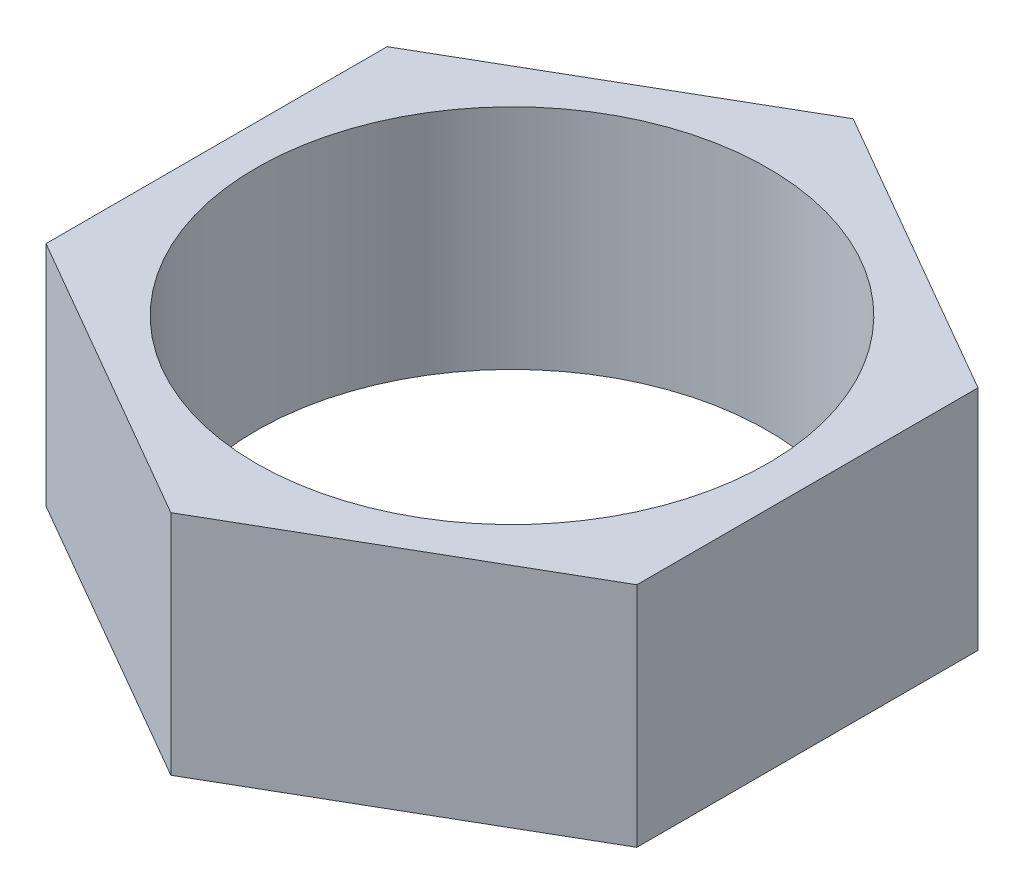
ISO-10303-21;
HEADER;
FILE_DESCRIPTION(('STEP AP214'),'2;1');
FILE_NAME('part.step','',(''),(''),'','','');
FILE_SCHEMA(('AUTOMOTIVE_DESIGN { 1 0 10303 214 1 1 1 1 }'));
ENDSEC;
DATA;
#1=APPLICATION_CONTEXT('core data for automotive mechanical design processes');
#2=APPLICATION_PROTOCOL_DEFINITION('international standard','automotive_design',2000,#1);
#3=PRODUCT_CONTEXT('',#1,'mechanical');
#4=PRODUCT('Part','Part','',(#3));
#5=PRODUCT_RELATED_PRODUCT_CATEGORY('part','',(#4));
#6=PRODUCT_DEFINITION_FORMATION('','',#4);
#7=PRODUCT_DEFINITION_CONTEXT('part definition',#1,'design');
#8=PRODUCT_DEFINITION('design','',#6,#7);
#9=PRODUCT_DEFINITION_SHAPE('','',#8);
#10=(LENGTH_UNIT() NAMED_UNIT(*) SI_UNIT(.MILLI.,.METRE.));
#11=(NAMED_UNIT(*) PLANE_ANGLE_UNIT() SI_UNIT($,.RADIAN.));
#12=(NAMED_UNIT(*) SI_UNIT($,.STERADIAN.) SOLID_ANGLE_UNIT());
#13=UNCERTAINTY_MEASURE_WITH_UNIT(LENGTH_MEASURE(1.E-05),#10,'distance_accuracy_value','');
#14=(GEOMETRIC_REPRESENTATION_CONTEXT(3) GLOBAL_UNCERTAINTY_ASSIGNED_CONTEXT((#13)) GLOBAL_UNIT_ASSIGNED_CONTEXT((#10,
#11,#12)) REPRESENTATION_CONTEXT('',''));
#15=CARTESIAN_POINT('',(0.,0.,0.));
#16=DIRECTION('',(0.,0.,1.));
#17=DIRECTION('',(1.,0.,0.));
#18=AXIS2_PLACEMENT_3D('',#15,#16,#17);
#19=CARTESIAN_POINT('',(0.,2.,0.));
#20=DIRECTION('',(0.,1.,0.));
#21=DIRECTION('',(0.,0.,1.));
#22=AXIS2_PLACEMENT_3D('',#19,#20,#21);
#23=PLANE('',#22);
#24=DIRECTION('',(-0.866025403784439,0.,-0.5));
#25=VECTOR('',#24,1.);
#26=CARTESIAN_POINT('',(2.59807621135332,2.,-1.5));
#27=LINE('',#26,#25);
#28=CARTESIAN_POINT('',(2.59807621135332,2.,-1.5));
#29=VERTEX_POINT('',#28);
#30=CARTESIAN_POINT('',(0.,2.,-3.));
#31=VERTEX_POINT('',#30);
#32=EDGE_CURVE('E135',#29,#31,#27,.T.);
#33=ORIENTED_EDGE('',*,*,#32,.T.);
#34=DIRECTION('',(-0.866025403784439,0.,0.5));
#35=VECTOR('',#34,1.);
#36=CARTESIAN_POINT('',(0.,2.,-3.));
#37=LINE('',#36,#35);
#38=CARTESIAN_POINT('',(-2.59807621135332,2.,-1.5));
#39=VERTEX_POINT('',#38);
#40=EDGE_CURVE('E93',#31,#39,#37,.T.);
#41=ORIENTED_EDGE('',*,*,#40,.T.);
#42=DIRECTION('',(0.,0.,1.));
#43=VECTOR('',#42,1.);
#44=CARTESIAN_POINT('',(-2.59807621135332,2.,-1.5));
#45=LINE('',#44,#43);
#46=CARTESIAN_POINT('',(-2.59807621135332,2.,1.5));
#47=VERTEX_POINT('',#46);
#48=EDGE_CURVE('E106',#39,#47,#45,.T.);
#49=ORIENTED_EDGE('',*,*,#48,.T.);
#50=DIRECTION('',(0.866025403784439,0.,0.5));
#51=VECTOR('',#50,1.);
#52=CARTESIAN_POINT('',(-2.59807621135332,2.,1.5));
#53=LINE('',#52,#51);
#54=CARTESIAN_POINT('',(0.,2.,3.));
#55=VERTEX_POINT('',#54);
#56=EDGE_CURVE('E100',#47,#55,#53,.T.);
#57=ORIENTED_EDGE('',*,*,#56,.T.);
#58=DIRECTION('',(0.866025403784439,0.,-0.5));
#59=VECTOR('',#58,1.);
#60=CARTESIAN_POINT('',(0.,2.,3.));
#61=LINE('',#60,#59);
#62=CARTESIAN_POINT('',(2.59807621135332,2.,1.5));
#63=VERTEX_POINT('',#62);
#64=EDGE_CURVE('E104',#55,#63,#61,.T.);
#65=ORIENTED_EDGE('',*,*,#64,.T.);
#66=DIRECTION('',(0.,0.,-1.));
#67=VECTOR('',#66,1.);
#68=CARTESIAN_POINT('',(2.59807621135332,2.,1.5));
#69=LINE('',#68,#67);
#70=EDGE_CURVE('E56',#63,#29,#69,.T.);
#71=ORIENTED_EDGE('',*,*,#70,.T.);
#72=EDGE_LOOP('',(#33,#41,#49,#57,#65,#71));
#73=FACE_BOUND('',#72,.T.);
#74=CARTESIAN_POINT('',(0.,2.,0.));
#75=DIRECTION('',(0.,1.,0.));
#76=DIRECTION('',(0.,0.,1.));
#77=AXIS2_PLACEMENT_3D('',#74,#75,#76);
#78=CIRCLE('',#77,2.25);
#79=CARTESIAN_POINT('',(0.,2.,2.25));
#80=VERTEX_POINT('',#79);
#81=EDGE_CURVE('E128',#80,#80,#78,.T.);
#82=ORIENTED_EDGE('',*,*,#81,.F.);
#83=EDGE_LOOP('',(#82));
#84=FACE_BOUND('',#83,.T.);
#85=ADVANCED_FACE('F39',(#73,#84),#23,.T.);
#86=CARTESIAN_POINT('',(0.,0.,0.));
#87=DIRECTION('',(0.,1.,0.));
#88=DIRECTION('',(0.,0.,1.));
#89=AXIS2_PLACEMENT_3D('',#86,#87,#88);
#90=PLANE('',#89);
#91=DIRECTION('',(-0.866025403784439,0.,-0.5));
#92=VECTOR('',#91,1.);
#93=CARTESIAN_POINT('',(2.59807621135332,0.,-1.5));
#94=LINE('',#93,#92);
#95=CARTESIAN_POINT('',(2.59807621135332,0.,-1.5));
#96=VERTEX_POINT('',#95);
#97=CARTESIAN_POINT('',(0.,0.,-3.));
#98=VERTEX_POINT('',#97);
#99=EDGE_CURVE('E124',#96,#98,#94,.T.);
#100=ORIENTED_EDGE('',*,*,#99,.F.);
#101=DIRECTION('',(0.,0.,-1.));
#102=VECTOR('',#101,1.);
#103=CARTESIAN_POINT('',(2.59807621135332,0.,1.5));
#104=LINE('',#103,#102);
#105=CARTESIAN_POINT('',(2.59807621135332,0.,1.5));
#106=VERTEX_POINT('',#105);
#107=EDGE_CURVE('E85',#106,#96,#104,.T.);
#108=ORIENTED_EDGE('',*,*,#107,.F.);
#109=DIRECTION('',(0.866025403784439,0.,-0.5));
#110=VECTOR('',#109,1.);
#111=CARTESIAN_POINT('',(0.,0.,3.));
#112=LINE('',#111,#110);
#113=CARTESIAN_POINT('',(0.,0.,3.));
#114=VERTEX_POINT('',#113);
#115=EDGE_CURVE('E79',#114,#106,#112,.T.);
#116=ORIENTED_EDGE('',*,*,#115,.F.);
#117=DIRECTION('',(0.866025403784439,0.,0.5));
#118=VECTOR('',#117,1.);
#119=CARTESIAN_POINT('',(-2.59807621135332,0.,1.5));
#120=LINE('',#119,#118);
#121=CARTESIAN_POINT('',(-2.59807621135332,0.,1.5));
#122=VERTEX_POINT('',#121);
#123=EDGE_CURVE('E114',#122,#114,#120,.T.);
#124=ORIENTED_EDGE('',*,*,#123,.F.);
#125=DIRECTION('',(0.,0.,1.));
#126=VECTOR('',#125,1.);
#127=CARTESIAN_POINT('',(-2.59807621135332,0.,-1.5));
#128=LINE('',#127,#126);
#129=CARTESIAN_POINT('',(-2.59807621135332,0.,-1.5));
#130=VERTEX_POINT('',#129);
#131=EDGE_CURVE('E130',#130,#122,#128,.T.);
#132=ORIENTED_EDGE('',*,*,#131,.F.);
#133=DIRECTION('',(-0.866025403784439,0.,0.5));
#134=VECTOR('',#133,1.);
#135=CARTESIAN_POINT('',(0.,0.,-3.));
#136=LINE('',#135,#134);
#137=EDGE_CURVE('E127',#98,#130,#136,.T.);
#138=ORIENTED_EDGE('',*,*,#137,.F.);
#139=EDGE_LOOP('',(#100,#108,#116,#124,#132,#138));
#140=FACE_BOUND('',#139,.T.);
#141=CARTESIAN_POINT('',(0.,0.,0.));
#142=DIRECTION('',(0.,1.,0.));
#143=DIRECTION('',(0.,0.,1.));
#144=AXIS2_PLACEMENT_3D('',#141,#142,#143);
#145=CIRCLE('',#144,2.25);
#146=CARTESIAN_POINT('',(0.,0.,2.25));
#147=VERTEX_POINT('',#146);
#148=EDGE_CURVE('E228',#147,#147,#145,.T.);
#149=ORIENTED_EDGE('',*,*,#148,.T.);
#150=EDGE_LOOP('',(#149));
#151=FACE_BOUND('',#150,.T.);
#152=ADVANCED_FACE('F144',(#140,#151),#90,.F.);
#153=CARTESIAN_POINT('',(2.59807621135332,2.,-1.5));
#154=DIRECTION('',(-0.5,0.,0.866025403784439));
#155=DIRECTION('',(0.866025403784439,0.,0.5));
#156=AXIS2_PLACEMENT_3D('',#153,#154,#155);
#157=PLANE('',#156);
#158=ORIENTED_EDGE('',*,*,#99,.T.);
#159=DIRECTION('',(0.,-1.,0.));
#160=VECTOR('',#159,1.);
#161=CARTESIAN_POINT('',(0.,2.,-3.));
#162=LINE('',#161,#160);
#163=EDGE_CURVE('E11',#31,#98,#162,.T.);
#164=ORIENTED_EDGE('',*,*,#163,.F.);
#165=ORIENTED_EDGE('',*,*,#32,.F.);
#166=DIRECTION('',(0.,-1.,0.));
#167=VECTOR('',#166,1.);
#168=CARTESIAN_POINT('',(2.59807621135332,2.,-1.5));
#169=LINE('',#168,#167);
#170=EDGE_CURVE('E120',#29,#96,#169,.T.);
#171=ORIENTED_EDGE('',*,*,#170,.T.);
#172=EDGE_LOOP('',(#158,#164,#165,#171));
#173=FACE_BOUND('',#172,.T.);
#174=ADVANCED_FACE('F41',(#173),#157,.F.);
#175=CARTESIAN_POINT('',(0.,2.,-3.));
#176=DIRECTION('',(0.5,0.,0.866025403784439));
#177=DIRECTION('',(0.866025403784439,0.,-0.5));
#178=AXIS2_PLACEMENT_3D('',#175,#176,#177);
#179=PLANE('',#178);
#180=ORIENTED_EDGE('',*,*,#137,.T.);
#181=DIRECTION('',(0.,-1.,0.));
#182=VECTOR('',#181,1.);
#183=CARTESIAN_POINT('',(-2.59807621135332,2.,-1.5));
#184=LINE('',#183,#182);
#185=EDGE_CURVE('E48',#39,#130,#184,.T.);
#186=ORIENTED_EDGE('',*,*,#185,.F.);
#187=ORIENTED_EDGE('',*,*,#40,.F.);
#188=ORIENTED_EDGE('',*,*,#163,.T.);
#189=EDGE_LOOP('',(#180,#186,#187,#188));
#190=FACE_BOUND('',#189,.T.);
#191=ADVANCED_FACE('F169',(#190),#179,.F.);
#192=CARTESIAN_POINT('',(-2.59807621135332,2.,-1.5));
#193=DIRECTION('',(1.,0.,0.));
#194=DIRECTION('',(0.,0.,-1.));
#195=AXIS2_PLACEMENT_3D('',#192,#193,#194);
#196=PLANE('',#195);
#197=ORIENTED_EDGE('',*,*,#131,.T.);
#198=DIRECTION('',(0.,-1.,0.));
#199=VECTOR('',#198,1.);
#200=CARTESIAN_POINT('',(-2.59807621135332,2.,1.5));
#201=LINE('',#200,#199);
#202=EDGE_CURVE('E115',#47,#122,#201,.T.);
#203=ORIENTED_EDGE('',*,*,#202,.F.);
#204=ORIENTED_EDGE('',*,*,#48,.F.);
#205=ORIENTED_EDGE('',*,*,#185,.T.);
#206=EDGE_LOOP('',(#197,#203,#204,#205));
#207=FACE_BOUND('',#206,.T.);
#208=ADVANCED_FACE('F141',(#207),#196,.F.);
#209=CARTESIAN_POINT('',(-2.59807621135332,2.,1.5));
#210=DIRECTION('',(0.5,0.,-0.866025403784439));
#211=DIRECTION('',(-0.866025403784439,0.,-0.5));
#212=AXIS2_PLACEMENT_3D('',#209,#210,#211);
#213=PLANE('',#212);
#214=ORIENTED_EDGE('',*,*,#123,.T.);
#215=DIRECTION('',(0.,-1.,0.));
#216=VECTOR('',#215,1.);
#217=CARTESIAN_POINT('',(0.,2.,3.));
#218=LINE('',#217,#216);
#219=EDGE_CURVE('E111',#55,#114,#218,.T.);
#220=ORIENTED_EDGE('',*,*,#219,.F.);
#221=ORIENTED_EDGE('',*,*,#56,.F.);
#222=ORIENTED_EDGE('',*,*,#202,.T.);
#223=EDGE_LOOP('',(#214,#220,#221,#222));
#224=FACE_BOUND('',#223,.T.);
#225=ADVANCED_FACE('F112',(#224),#213,.F.);
#226=CARTESIAN_POINT('',(0.,2.,3.));
#227=DIRECTION('',(-0.5,0.,-0.866025403784439));
#228=DIRECTION('',(-0.866025403784439,0.,0.5));
#229=AXIS2_PLACEMENT_3D('',#226,#227,#228);
#230=PLANE('',#229);
#231=ORIENTED_EDGE('',*,*,#115,.T.);
#232=DIRECTION('',(0.,-1.,0.));
#233=VECTOR('',#232,1.);
#234=CARTESIAN_POINT('',(2.59807621135332,2.,1.5));
#235=LINE('',#234,#233);
#236=EDGE_CURVE('E116',#63,#106,#235,.T.);
#237=ORIENTED_EDGE('',*,*,#236,.F.);
#238=ORIENTED_EDGE('',*,*,#64,.F.);
#239=ORIENTED_EDGE('',*,*,#219,.T.);
#240=EDGE_LOOP('',(#231,#237,#238,#239));
#241=FACE_BOUND('',#240,.T.);
#242=ADVANCED_FACE('F118',(#241),#230,.F.);
#243=CARTESIAN_POINT('',(2.59807621135332,2.,1.5));
#244=DIRECTION('',(-1.,0.,0.));
#245=DIRECTION('',(0.,0.,1.));
#246=AXIS2_PLACEMENT_3D('',#243,#244,#245);
#247=PLANE('',#246);
#248=ORIENTED_EDGE('',*,*,#107,.T.);
#249=ORIENTED_EDGE('',*,*,#170,.F.);
#250=ORIENTED_EDGE('',*,*,#70,.F.);
#251=ORIENTED_EDGE('',*,*,#236,.T.);
#252=EDGE_LOOP('',(#248,#249,#250,#251));
#253=FACE_BOUND('',#252,.T.);
#254=ADVANCED_FACE('F149',(#253),#247,.F.);
#255=CARTESIAN_POINT('',(0.,2.,0.));
#256=DIRECTION('',(0.,-1.,0.));
#257=DIRECTION('',(0.,0.,-1.));
#258=AXIS2_PLACEMENT_3D('',#255,#256,#257);
#259=CYLINDRICAL_SURFACE('',#258,2.25);
#260=ORIENTED_EDGE('',*,*,#81,.T.);
#261=EDGE_LOOP('',(#260));
#262=FACE_BOUND('',#261,.T.);
#263=ORIENTED_EDGE('',*,*,#148,.F.);
#264=EDGE_LOOP('',(#263));
#265=FACE_BOUND('',#264,.T.);
#266=ADVANCED_FACE('F151',(#262,#265),#259,.F.);
#267=CLOSED_SHELL('',(#85,#152,#174,#191,#208,#225,#242,#254,#266));
#268=MANIFOLD_SOLID_BREP('B2',#267);
#269=ADVANCED_BREP_SHAPE_REPRESENTATION('',(#18,#268),#14);
#270=SHAPE_DEFINITION_REPRESENTATION(#9,#269);
ENDSEC;
END-ISO-10303-21;
